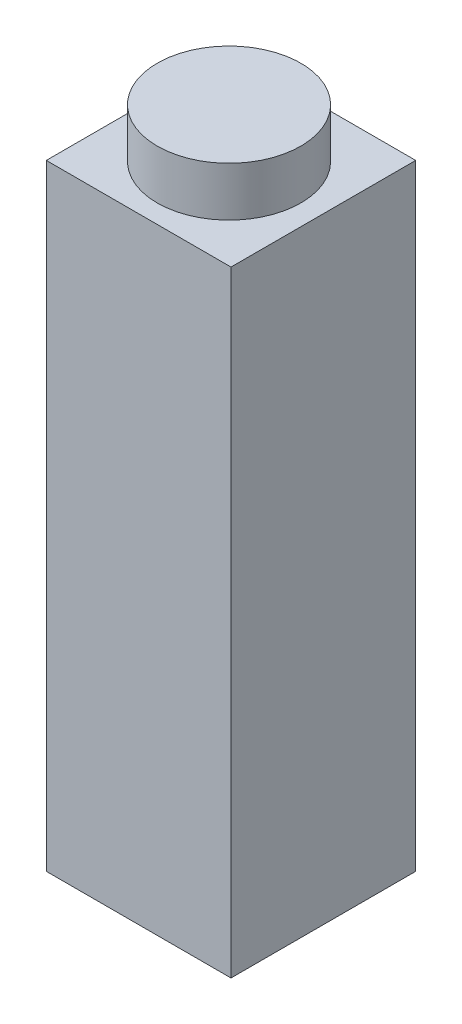
ISO-10303-21;
HEADER;
FILE_DESCRIPTION(('STEP AP214'),'2;1');
FILE_NAME('part.step','',(''),(''),'','','');
FILE_SCHEMA(('AUTOMOTIVE_DESIGN { 1 0 10303 214 1 1 1 1 }'));
ENDSEC;
DATA;
#1=APPLICATION_CONTEXT('core data for automotive mechanical design processes');
#2=APPLICATION_PROTOCOL_DEFINITION('international standard','automotive_design',2000,#1);
#3=PRODUCT_CONTEXT('',#1,'mechanical');
#4=PRODUCT('Part','Part','',(#3));
#5=PRODUCT_RELATED_PRODUCT_CATEGORY('part','',(#4));
#6=PRODUCT_DEFINITION_FORMATION('','',#4);
#7=PRODUCT_DEFINITION_CONTEXT('part definition',#1,'design');
#8=PRODUCT_DEFINITION('design','',#6,#7);
#9=PRODUCT_DEFINITION_SHAPE('','',#8);
#10=(LENGTH_UNIT() NAMED_UNIT(*) SI_UNIT(.MILLI.,.METRE.));
#11=(NAMED_UNIT(*) PLANE_ANGLE_UNIT() SI_UNIT($,.RADIAN.));
#12=(NAMED_UNIT(*) SI_UNIT($,.STERADIAN.) SOLID_ANGLE_UNIT());
#13=UNCERTAINTY_MEASURE_WITH_UNIT(LENGTH_MEASURE(1.E-05),#10,'distance_accuracy_value','');
#14=(GEOMETRIC_REPRESENTATION_CONTEXT(3) GLOBAL_UNCERTAINTY_ASSIGNED_CONTEXT((#13)) GLOBAL_UNIT_ASSIGNED_CONTEXT((#10,
#11,#12)) REPRESENTATION_CONTEXT('',''));
#15=CARTESIAN_POINT('',(0.,0.,0.));
#16=DIRECTION('',(0.,0.,1.));
#17=DIRECTION('',(1.,0.,0.));
#18=AXIS2_PLACEMENT_3D('',#15,#16,#17);
#19=CARTESIAN_POINT('',(2.25,15.,2.25));
#20=DIRECTION('',(-1.,0.,0.));
#21=DIRECTION('',(0.,0.,1.));
#22=AXIS2_PLACEMENT_3D('',#19,#20,#21);
#23=PLANE('',#22);
#24=DIRECTION('',(0.,0.,-1.));
#25=VECTOR('',#24,1.);
#26=CARTESIAN_POINT('',(2.25,0.,2.25));
#27=LINE('',#26,#25);
#28=CARTESIAN_POINT('',(2.25,0.,2.25));
#29=VERTEX_POINT('',#28);
#30=CARTESIAN_POINT('',(2.25,0.,-2.25));
#31=VERTEX_POINT('',#30);
#32=EDGE_CURVE('E99',#29,#31,#27,.T.);
#33=ORIENTED_EDGE('',*,*,#32,.T.);
#34=DIRECTION('',(0.,-1.,0.));
#35=VECTOR('',#34,1.);
#36=CARTESIAN_POINT('',(2.25,15.,-2.25));
#37=LINE('',#36,#35);
#38=CARTESIAN_POINT('',(2.25,15.,-2.25));
#39=VERTEX_POINT('',#38);
#40=EDGE_CURVE('E36',#39,#31,#37,.T.);
#41=ORIENTED_EDGE('',*,*,#40,.F.);
#42=DIRECTION('',(0.,0.,-1.));
#43=VECTOR('',#42,1.);
#44=CARTESIAN_POINT('',(2.25,15.,2.25));
#45=LINE('',#44,#43);
#46=CARTESIAN_POINT('',(2.25,15.,2.25));
#47=VERTEX_POINT('',#46);
#48=EDGE_CURVE('E86',#47,#39,#45,.T.);
#49=ORIENTED_EDGE('',*,*,#48,.F.);
#50=DIRECTION('',(0.,-1.,0.));
#51=VECTOR('',#50,1.);
#52=CARTESIAN_POINT('',(2.25,15.,2.25));
#53=LINE('',#52,#51);
#54=EDGE_CURVE('E95',#47,#29,#53,.T.);
#55=ORIENTED_EDGE('',*,*,#54,.T.);
#56=EDGE_LOOP('',(#33,#41,#49,#55));
#57=FACE_BOUND('',#56,.T.);
#58=ADVANCED_FACE('F33',(#57),#23,.F.);
#59=CARTESIAN_POINT('',(-2.25,15.,-2.25));
#60=DIRECTION('',(0.,0.,1.));
#61=DIRECTION('',(1.,0.,0.));
#62=AXIS2_PLACEMENT_3D('',#59,#60,#61);
#63=PLANE('',#62);
#64=DIRECTION('',(-1.,0.,0.));
#65=VECTOR('',#64,1.);
#66=CARTESIAN_POINT('',(-2.25,0.,-2.25));
#67=LINE('',#66,#65);
#68=CARTESIAN_POINT('',(-2.25,0.,-2.25));
#69=VERTEX_POINT('',#68);
#70=EDGE_CURVE('E91',#31,#69,#67,.T.);
#71=ORIENTED_EDGE('',*,*,#70,.T.);
#72=DIRECTION('',(0.,-1.,0.));
#73=VECTOR('',#72,1.);
#74=CARTESIAN_POINT('',(-2.25,15.,-2.25));
#75=LINE('',#74,#73);
#76=CARTESIAN_POINT('',(-2.25,15.,-2.25));
#77=VERTEX_POINT('',#76);
#78=EDGE_CURVE('E89',#77,#69,#75,.T.);
#79=ORIENTED_EDGE('',*,*,#78,.F.);
#80=DIRECTION('',(-1.,0.,0.));
#81=VECTOR('',#80,1.);
#82=CARTESIAN_POINT('',(-2.25,15.,-2.25));
#83=LINE('',#82,#81);
#84=EDGE_CURVE('E81',#39,#77,#83,.T.);
#85=ORIENTED_EDGE('',*,*,#84,.F.);
#86=ORIENTED_EDGE('',*,*,#40,.T.);
#87=EDGE_LOOP('',(#71,#79,#85,#86));
#88=FACE_BOUND('',#87,.T.);
#89=ADVANCED_FACE('F90',(#88),#63,.F.);
#90=CARTESIAN_POINT('',(-2.25,15.,2.25));
#91=DIRECTION('',(1.,0.,0.));
#92=DIRECTION('',(0.,0.,-1.));
#93=AXIS2_PLACEMENT_3D('',#90,#91,#92);
#94=PLANE('',#93);
#95=DIRECTION('',(0.,0.,1.));
#96=VECTOR('',#95,1.);
#97=CARTESIAN_POINT('',(-2.25,0.,2.25));
#98=LINE('',#97,#96);
#99=CARTESIAN_POINT('',(-2.25,0.,2.25));
#100=VERTEX_POINT('',#99);
#101=EDGE_CURVE('E67',#69,#100,#98,.T.);
#102=ORIENTED_EDGE('',*,*,#101,.T.);
#103=DIRECTION('',(0.,-1.,0.));
#104=VECTOR('',#103,1.);
#105=CARTESIAN_POINT('',(-2.25,15.,2.25));
#106=LINE('',#105,#104);
#107=CARTESIAN_POINT('',(-2.25,15.,2.25));
#108=VERTEX_POINT('',#107);
#109=EDGE_CURVE('E92',#108,#100,#106,.T.);
#110=ORIENTED_EDGE('',*,*,#109,.F.);
#111=DIRECTION('',(0.,0.,1.));
#112=VECTOR('',#111,1.);
#113=CARTESIAN_POINT('',(-2.25,15.,2.25));
#114=LINE('',#113,#112);
#115=EDGE_CURVE('E84',#77,#108,#114,.T.);
#116=ORIENTED_EDGE('',*,*,#115,.F.);
#117=ORIENTED_EDGE('',*,*,#78,.T.);
#118=EDGE_LOOP('',(#102,#110,#116,#117));
#119=FACE_BOUND('',#118,.T.);
#120=ADVANCED_FACE('F93',(#119),#94,.F.);
#121=CARTESIAN_POINT('',(-2.25,15.,2.25));
#122=DIRECTION('',(0.,0.,-1.));
#123=DIRECTION('',(-1.,0.,0.));
#124=AXIS2_PLACEMENT_3D('',#121,#122,#123);
#125=PLANE('',#124);
#126=DIRECTION('',(1.,0.,0.));
#127=VECTOR('',#126,1.);
#128=CARTESIAN_POINT('',(-2.25,0.,2.25));
#129=LINE('',#128,#127);
#130=EDGE_CURVE('E73',#100,#29,#129,.T.);
#131=ORIENTED_EDGE('',*,*,#130,.T.);
#132=ORIENTED_EDGE('',*,*,#54,.F.);
#133=DIRECTION('',(1.,0.,0.));
#134=VECTOR('',#133,1.);
#135=CARTESIAN_POINT('',(-2.25,15.,2.25));
#136=LINE('',#135,#134);
#137=EDGE_CURVE('E50',#108,#47,#136,.T.);
#138=ORIENTED_EDGE('',*,*,#137,.F.);
#139=ORIENTED_EDGE('',*,*,#109,.T.);
#140=EDGE_LOOP('',(#131,#132,#138,#139));
#141=FACE_BOUND('',#140,.T.);
#142=ADVANCED_FACE('F107',(#141),#125,.F.);
#143=CARTESIAN_POINT('',(0.,15.,0.));
#144=DIRECTION('',(0.,-1.,0.));
#145=DIRECTION('',(0.,0.,-1.));
#146=AXIS2_PLACEMENT_3D('',#143,#144,#145);
#147=PLANE('',#146);
#148=CARTESIAN_POINT('',(0.,15.,0.0477188704053333));
#149=DIRECTION('',(0.,1.,0.));
#150=DIRECTION('',(0.,0.,1.));
#151=AXIS2_PLACEMENT_3D('',#148,#149,#150);
#152=CIRCLE('',#151,1.75);
#153=CARTESIAN_POINT('',(0.,15.,1.79771887040533));
#154=VERTEX_POINT('',#153);
#155=EDGE_CURVE('E11',#154,#154,#152,.T.);
#156=ORIENTED_EDGE('',*,*,#155,.F.);
#157=EDGE_LOOP('',(#156));
#158=FACE_BOUND('',#157,.T.);
#159=ORIENTED_EDGE('',*,*,#48,.T.);
#160=ORIENTED_EDGE('',*,*,#84,.T.);
#161=ORIENTED_EDGE('',*,*,#115,.T.);
#162=ORIENTED_EDGE('',*,*,#137,.T.);
#163=EDGE_LOOP('',(#159,#160,#161,#162));
#164=FACE_BOUND('',#163,.T.);
#165=ADVANCED_FACE('F82',(#158,#164),#147,.F.);
#166=CARTESIAN_POINT('',(0.,0.,0.));
#167=DIRECTION('',(0.,-1.,0.));
#168=DIRECTION('',(0.,0.,-1.));
#169=AXIS2_PLACEMENT_3D('',#166,#167,#168);
#170=PLANE('',#169);
#171=CARTESIAN_POINT('',(0.,0.,0.));
#172=DIRECTION('',(0.,-1.,0.));
#173=DIRECTION('',(0.,0.,-1.));
#174=AXIS2_PLACEMENT_3D('',#171,#172,#173);
#175=CIRCLE('',#174,1.);
#176=CARTESIAN_POINT('',(0.,0.,-1.));
#177=VERTEX_POINT('',#176);
#178=EDGE_CURVE('E113',#177,#177,#175,.T.);
#179=ORIENTED_EDGE('',*,*,#178,.F.);
#180=EDGE_LOOP('',(#179));
#181=FACE_BOUND('',#180,.T.);
#182=ORIENTED_EDGE('',*,*,#32,.F.);
#183=ORIENTED_EDGE('',*,*,#130,.F.);
#184=ORIENTED_EDGE('',*,*,#101,.F.);
#185=ORIENTED_EDGE('',*,*,#70,.F.);
#186=EDGE_LOOP('',(#182,#183,#184,#185));
#187=FACE_BOUND('',#186,.T.);
#188=ADVANCED_FACE('F110',(#181,#187),#170,.T.);
#189=CARTESIAN_POINT('',(0.,0.5,0.));
#190=DIRECTION('',(0.,-1.,0.));
#191=DIRECTION('',(0.,0.,-1.));
#192=AXIS2_PLACEMENT_3D('',#189,#190,#191);
#193=CYLINDRICAL_SURFACE('',#192,1.);
#194=CARTESIAN_POINT('',(0.,0.5,0.));
#195=DIRECTION('',(0.,-1.,0.));
#196=DIRECTION('',(0.,0.,-1.));
#197=AXIS2_PLACEMENT_3D('',#194,#195,#196);
#198=CIRCLE('',#197,1.);
#199=CARTESIAN_POINT('',(0.,0.5,-1.));
#200=VERTEX_POINT('',#199);
#201=EDGE_CURVE('E102',#200,#200,#198,.T.);
#202=ORIENTED_EDGE('',*,*,#201,.F.);
#203=EDGE_LOOP('',(#202));
#204=FACE_BOUND('',#203,.T.);
#205=ORIENTED_EDGE('',*,*,#178,.T.);
#206=EDGE_LOOP('',(#205));
#207=FACE_BOUND('',#206,.T.);
#208=ADVANCED_FACE('F137',(#204,#207),#193,.F.);
#209=CARTESIAN_POINT('',(0.,0.5,0.));
#210=DIRECTION('',(0.,-1.,0.));
#211=DIRECTION('',(0.,0.,-1.));
#212=AXIS2_PLACEMENT_3D('',#209,#210,#211);
#213=PLANE('',#212);
#214=ORIENTED_EDGE('',*,*,#201,.T.);
#215=EDGE_LOOP('',(#214));
#216=FACE_BOUND('',#215,.T.);
#217=ADVANCED_FACE('F127',(#216),#213,.T.);
#218=CARTESIAN_POINT('',(0.,16.2,0.0477188704053333));
#219=DIRECTION('',(0.,-1.,0.));
#220=DIRECTION('',(0.,0.,-1.));
#221=AXIS2_PLACEMENT_3D('',#218,#219,#220);
#222=CYLINDRICAL_SURFACE('',#221,1.75);
#223=CARTESIAN_POINT('',(0.,16.2,0.0477188704053333));
#224=DIRECTION('',(0.,1.,0.));
#225=DIRECTION('',(0.,0.,1.));
#226=AXIS2_PLACEMENT_3D('',#223,#224,#225);
#227=CIRCLE('',#226,1.75);
#228=CARTESIAN_POINT('',(0.,16.2,1.79771887040533));
#229=VERTEX_POINT('',#228);
#230=EDGE_CURVE('E116',#229,#229,#227,.T.);
#231=ORIENTED_EDGE('',*,*,#230,.F.);
#232=EDGE_LOOP('',(#231));
#233=FACE_BOUND('',#232,.T.);
#234=ORIENTED_EDGE('',*,*,#155,.T.);
#235=EDGE_LOOP('',(#234));
#236=FACE_BOUND('',#235,.T.);
#237=ADVANCED_FACE('F124',(#233,#236),#222,.T.);
#238=CARTESIAN_POINT('',(0.,16.2,0.0477188704053333));
#239=DIRECTION('',(0.,1.,0.));
#240=DIRECTION('',(0.,0.,1.));
#241=AXIS2_PLACEMENT_3D('',#238,#239,#240);
#242=PLANE('',#241);
#243=ORIENTED_EDGE('',*,*,#230,.T.);
#244=EDGE_LOOP('',(#243));
#245=FACE_BOUND('',#244,.T.);
#246=ADVANCED_FACE('F122',(#245),#242,.T.);
#247=CLOSED_SHELL('',(#58,#89,#120,#142,#165,#188,#208,#217,#237,#246));
#248=MANIFOLD_SOLID_BREP('B2',#247);
#249=ADVANCED_BREP_SHAPE_REPRESENTATION('',(#18,#248),#14);
#250=SHAPE_DEFINITION_REPRESENTATION(#9,#249);
ENDSEC;
END-ISO-10303-21;
